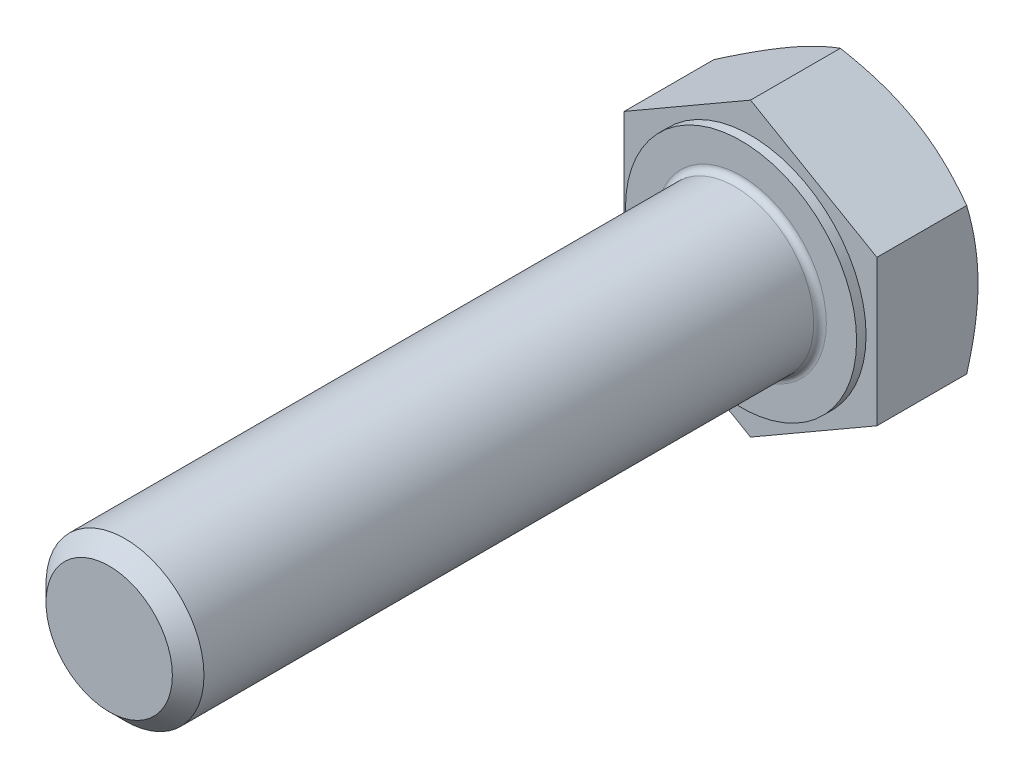
ISO-10303-21;
HEADER;
FILE_DESCRIPTION(('STEP AP214'),'2;1');
FILE_NAME('part.step','',(''),(''),'','','');
FILE_SCHEMA(('AUTOMOTIVE_DESIGN { 1 0 10303 214 1 1 1 1 }'));
ENDSEC;
DATA;
#1=APPLICATION_CONTEXT('core data for automotive mechanical design processes');
#2=APPLICATION_PROTOCOL_DEFINITION('international standard','automotive_design',2000,#1);
#3=PRODUCT_CONTEXT('',#1,'mechanical');
#4=PRODUCT('Part','Part','',(#3));
#5=PRODUCT_RELATED_PRODUCT_CATEGORY('part','',(#4));
#6=PRODUCT_DEFINITION_FORMATION('','',#4);
#7=PRODUCT_DEFINITION_CONTEXT('part definition',#1,'design');
#8=PRODUCT_DEFINITION('design','',#6,#7);
#9=PRODUCT_DEFINITION_SHAPE('','',#8);
#10=(LENGTH_UNIT() NAMED_UNIT(*) SI_UNIT(.MILLI.,.METRE.));
#11=(NAMED_UNIT(*) PLANE_ANGLE_UNIT() SI_UNIT($,.RADIAN.));
#12=(NAMED_UNIT(*) SI_UNIT($,.STERADIAN.) SOLID_ANGLE_UNIT());
#13=UNCERTAINTY_MEASURE_WITH_UNIT(LENGTH_MEASURE(1.E-05),#10,'distance_accuracy_value','');
#14=(GEOMETRIC_REPRESENTATION_CONTEXT(3) GLOBAL_UNCERTAINTY_ASSIGNED_CONTEXT((#13)) GLOBAL_UNIT_ASSIGNED_CONTEXT((#10,
#11,#12)) REPRESENTATION_CONTEXT('',''));
#15=CARTESIAN_POINT('',(0.,0.,0.));
#16=DIRECTION('',(0.,0.,1.));
#17=DIRECTION('',(1.,0.,0.));
#18=AXIS2_PLACEMENT_3D('',#15,#16,#17);
#19=CARTESIAN_POINT('',(0.,0.,7.));
#20=DIRECTION('',(0.,0.,1.));
#21=DIRECTION('',(1.,0.,0.));
#22=AXIS2_PLACEMENT_3D('',#19,#20,#21);
#23=PLANE('',#22);
#24=CARTESIAN_POINT('',(0.,0.,7.));
#25=DIRECTION('',(0.,0.,1.));
#26=DIRECTION('',(1.,0.,0.));
#27=AXIS2_PLACEMENT_3D('',#24,#25,#26);
#28=CIRCLE('',#27,5.4);
#29=CARTESIAN_POINT('',(5.4,0.,7.));
#30=VERTEX_POINT('',#29);
#31=EDGE_CURVE('E11',#30,#30,#28,.F.);
#32=ORIENTED_EDGE('',*,*,#31,.T.);
#33=EDGE_LOOP('',(#32));
#34=FACE_BOUND('',#33,.T.);
#35=CARTESIAN_POINT('',(0.,0.,7.));
#36=DIRECTION('',(0.,0.,1.));
#37=DIRECTION('',(1.,0.,0.));
#38=AXIS2_PLACEMENT_3D('',#35,#36,#37);
#39=CIRCLE('',#38,7.315);
#40=CARTESIAN_POINT('',(7.315,0.,7.));
#41=VERTEX_POINT('',#40);
#42=EDGE_CURVE('E263',#41,#41,#39,.T.);
#43=ORIENTED_EDGE('',*,*,#42,.T.);
#44=EDGE_LOOP('',(#43));
#45=FACE_BOUND('',#44,.T.);
#46=ADVANCED_FACE('F28',(#34,#45),#23,.T.);
#47=CARTESIAN_POINT('',(8.,-4.61880215351701,6.4));
#48=DIRECTION('',(0.,0.,1.));
#49=DIRECTION('',(1.,0.,0.));
#50=AXIS2_PLACEMENT_3D('',#47,#48,#49);
#51=PLANE('',#50);
#52=DIRECTION('',(0.866025403784439,0.5,0.));
#53=VECTOR('',#52,1.);
#54=CARTESIAN_POINT('',(0.,-9.23760430703402,6.4));
#55=LINE('',#54,#53);
#56=CARTESIAN_POINT('',(0.,-9.23760430703402,6.4));
#57=VERTEX_POINT('',#56);
#58=CARTESIAN_POINT('',(8.,-4.61880215351701,6.4));
#59=VERTEX_POINT('',#58);
#60=EDGE_CURVE('E283',#57,#59,#55,.T.);
#61=ORIENTED_EDGE('',*,*,#60,.T.);
#62=DIRECTION('',(0.,1.,0.));
#63=VECTOR('',#62,1.);
#64=CARTESIAN_POINT('',(8.,-4.61880215351701,6.4));
#65=LINE('',#64,#63);
#66=CARTESIAN_POINT('',(8.,4.61880215351701,6.4));
#67=VERTEX_POINT('',#66);
#68=EDGE_CURVE('E288',#59,#67,#65,.T.);
#69=ORIENTED_EDGE('',*,*,#68,.T.);
#70=DIRECTION('',(-0.866025403784438,0.5,0.));
#71=VECTOR('',#70,1.);
#72=CARTESIAN_POINT('',(8.,4.61880215351701,6.4));
#73=LINE('',#72,#71);
#74=CARTESIAN_POINT('',(0.,9.23760430703401,6.4));
#75=VERTEX_POINT('',#74);
#76=EDGE_CURVE('E285',#67,#75,#73,.T.);
#77=ORIENTED_EDGE('',*,*,#76,.T.);
#78=DIRECTION('',(-0.866025403784439,-0.5,0.));
#79=VECTOR('',#78,1.);
#80=CARTESIAN_POINT('',(0.,9.23760430703401,6.4));
#81=LINE('',#80,#79);
#82=CARTESIAN_POINT('',(-8.,4.61880215351701,6.4));
#83=VERTEX_POINT('',#82);
#84=EDGE_CURVE('E284',#75,#83,#81,.T.);
#85=ORIENTED_EDGE('',*,*,#84,.T.);
#86=DIRECTION('',(0.,-1.,0.));
#87=VECTOR('',#86,1.);
#88=CARTESIAN_POINT('',(-8.,4.61880215351701,6.4));
#89=LINE('',#88,#87);
#90=CARTESIAN_POINT('',(-8.,-4.618802153517,6.4));
#91=VERTEX_POINT('',#90);
#92=EDGE_CURVE('E206',#83,#91,#89,.T.);
#93=ORIENTED_EDGE('',*,*,#92,.T.);
#94=DIRECTION('',(0.866025403784438,-0.5,0.));
#95=VECTOR('',#94,1.);
#96=CARTESIAN_POINT('',(-8.,-4.618802153517,6.4));
#97=LINE('',#96,#95);
#98=EDGE_CURVE('E278',#91,#57,#97,.T.);
#99=ORIENTED_EDGE('',*,*,#98,.T.);
#100=EDGE_LOOP('',(#61,#69,#77,#85,#93,#99));
#101=FACE_BOUND('',#100,.T.);
#102=CARTESIAN_POINT('',(0.,0.,6.4));
#103=DIRECTION('',(0.,0.,1.));
#104=DIRECTION('',(1.,0.,0.));
#105=AXIS2_PLACEMENT_3D('',#102,#103,#104);
#106=CIRCLE('',#105,7.315);
#107=CARTESIAN_POINT('',(7.315,0.,6.4));
#108=VERTEX_POINT('',#107);
#109=EDGE_CURVE('E266',#108,#108,#106,.T.);
#110=ORIENTED_EDGE('',*,*,#109,.F.);
#111=EDGE_LOOP('',(#110));
#112=FACE_BOUND('',#111,.T.);
#113=ADVANCED_FACE('F243',(#101,#112),#51,.T.);
#114=CARTESIAN_POINT('',(0.,-9.23760430703402,6.4));
#115=DIRECTION('',(-0.5,0.866025403784439,0.));
#116=DIRECTION('',(-0.866025403784439,-0.5,0.));
#117=AXIS2_PLACEMENT_3D('',#114,#115,#116);
#118=PLANE('',#117);
#119=CARTESIAN_POINT('',(8.0002,-4.61868668346317,0.714597847732972));
#120=CARTESIAN_POINT('',(7.8243512161201,-4.7202130261729,0.655990714047297));
#121=CARTESIAN_POINT('',(7.64784680569387,-4.82211789504564,0.60004340104729));
#122=CARTESIAN_POINT('',(7.29340453712154,-5.02675523421806,0.494201005024666));
#123=CARTESIAN_POINT('',(7.11546609530729,-5.1294880414987,0.444308534431067));
#124=CARTESIAN_POINT('',(6.57880176237736,-5.43933133858027,0.304692797206867));
#125=CARTESIAN_POINT('',(6.21795741776428,-5.64766491807818,0.22528117097837));
#126=CARTESIAN_POINT('',(5.67796082979595,-5.95943209350318,0.132161646294492));
#127=CARTESIAN_POINT('',(5.50042181035671,-6.06193429416808,0.105634581029128));
#128=CARTESIAN_POINT('',(5.1445408870398,-6.26740224104455,0.0611531748588798));
#129=CARTESIAN_POINT('',(4.96619905550676,-6.37036794548793,0.0431980765145843));
#130=CARTESIAN_POINT('',(4.6092083151764,-6.57647664551586,0.0163156484918698));
#131=CARTESIAN_POINT('',(4.4305599863905,-6.67961930623068,0.00737807354623821));
#132=CARTESIAN_POINT('',(4.07309829490261,-6.88599991003619,-0.00127769603486519));
#133=CARTESIAN_POINT('',(3.89428493746993,-6.98923785008465,-0.000996175497145661));
#134=CARTESIAN_POINT('',(3.55998663298309,-7.18224506616976,0.00814502526878037));
#135=CARTESIAN_POINT('',(3.40447809566132,-7.27202796205377,0.015889604367375));
#136=CARTESIAN_POINT('',(3.09382523825949,-7.45138347289924,0.0382011348534339));
#137=CARTESIAN_POINT('',(2.93868094344,-7.54095607327651,0.0527685461381527));
#138=CARTESIAN_POINT('',(2.47384868410518,-7.80932710333149,0.106360690527541));
#139=CARTESIAN_POINT('',(2.16498351281828,-7.98765049311728,0.155268641669149));
#140=CARTESIAN_POINT('',(1.5439767712397,-8.34618890253624,0.277539403234317));
#141=CARTESIAN_POINT('',(1.23191445788552,-8.52635816315522,0.351420520376003));
#142=CARTESIAN_POINT('',(0.612443518305242,-8.88400987687704,0.519100141254974));
#143=CARTESIAN_POINT('',(0.30502695910825,-9.06149691008277,0.612859260854457));
#144=CARTESIAN_POINT('',(-0.000199999999999189,-9.23771977708785,0.714597847732977));
#145=B_SPLINE_CURVE_WITH_KNOTS('',3,(#119,#120,#121,#122,#123,#124,#125,#126,#127,#128,#129,
#130,#131,#132,#133,#134,#135,#136,#137,#138,#139,#140,#141,#142,#143,#144),.UNSPECIFIED.,.F.,
.F.,(4,2,2,2,2,2,2,2,2,2,2,2,4),(0.,0.63397354372135,1.26821965714356,2.53934712434766,
3.15934343977049,3.77928496069784,4.39852133866766,5.01773858515595,5.55680239410249,
6.09590254421148,7.17487077411835,8.27776850154292,9.37850115249054),.UNSPECIFIED.);
#146=CARTESIAN_POINT('',(8.,-4.61880215351701,0.71453117981632));
#147=VERTEX_POINT('',#146);
#148=CARTESIAN_POINT('',(4.00000000000001,-6.92820323027551,0.));
#149=VERTEX_POINT('',#148);
#150=EDGE_CURVE('E121',#147,#149,#145,.T.);
#151=ORIENTED_EDGE('',*,*,#150,.F.);
#152=DIRECTION('',(0.,0.,-1.));
#153=VECTOR('',#152,1.);
#154=CARTESIAN_POINT('',(8.,-4.61880215351701,6.4));
#155=LINE('',#154,#153);
#156=EDGE_CURVE('E125',#59,#147,#155,.T.);
#157=ORIENTED_EDGE('',*,*,#156,.F.);
#158=ORIENTED_EDGE('',*,*,#60,.F.);
#159=DIRECTION('',(0.,0.,-1.));
#160=VECTOR('',#159,1.);
#161=CARTESIAN_POINT('',(0.,-9.23760430703402,6.4));
#162=LINE('',#161,#160);
#163=CARTESIAN_POINT('',(0.,-9.23760430703402,0.714531179816326));
#164=VERTEX_POINT('',#163);
#165=EDGE_CURVE('E213',#57,#164,#162,.T.);
#166=ORIENTED_EDGE('',*,*,#165,.T.);
#167=EDGE_CURVE('E180',#149,#164,#145,.T.);
#168=ORIENTED_EDGE('',*,*,#167,.F.);
#169=EDGE_LOOP('',(#151,#157,#158,#166,#168));
#170=FACE_BOUND('',#169,.T.);
#171=ADVANCED_FACE('F30',(#170),#118,.F.);
#172=CARTESIAN_POINT('',(8.,-4.61880215351701,6.4));
#173=DIRECTION('',(-1.,0.,0.));
#174=DIRECTION('',(0.,0.,1.));
#175=AXIS2_PLACEMENT_3D('',#172,#173,#174);
#176=PLANE('',#175);
#177=CARTESIAN_POINT('',(8.,-12.5978512302027,3.99718793503962));
#178=CARTESIAN_POINT('',(8.,-12.246746193335,3.82611053576499));
#179=CARTESIAN_POINT('',(8.,-11.8948553361064,3.65661925769115));
#180=CARTESIAN_POINT('',(8.,-11.1890846886661,3.3216974888996));
#181=CARTESIAN_POINT('',(8.,-10.835204611765,3.15626760296746));
#182=CARTESIAN_POINT('',(8.,-10.1233054863219,2.82956556361424));
#183=CARTESIAN_POINT('',(8.,-9.76527449682906,2.6683193432713));
#184=CARTESIAN_POINT('',(8.,-9.04643054583631,2.35217634713934));
#185=CARTESIAN_POINT('',(8.,-8.68561771136527,2.19727928344183));
#186=CARTESIAN_POINT('',(8.,-7.94836823401664,1.89039831156782));
#187=CARTESIAN_POINT('',(8.,-7.5718160886765,1.7386904007907));
#188=CARTESIAN_POINT('',(8.,-6.81437869582219,1.44630030243335));
#189=CARTESIAN_POINT('',(8.,-6.43349297805851,1.30561932474278));
#190=CARTESIAN_POINT('',(8.,-5.6674305979848,1.03883650463493));
#191=CARTESIAN_POINT('',(8.,-5.28226375872601,0.912706749891732));
#192=CARTESIAN_POINT('',(8.,-4.50642197899132,0.678945126437137));
#193=CARTESIAN_POINT('',(8.,-4.11574875302432,0.571307631748258));
#194=CARTESIAN_POINT('',(8.,-3.33076858815041,0.380144492729918));
#195=CARTESIAN_POINT('',(8.,-2.93649538955179,0.296483961640422));
#196=CARTESIAN_POINT('',(8.,-2.34134760728195,0.192507403054087));
#197=CARTESIAN_POINT('',(8.,-2.1423290800816,0.161432948424243));
#198=CARTESIAN_POINT('',(8.,-1.74323916388529,0.107059745466563));
#199=CARTESIAN_POINT('',(8.,-1.54316787913643,0.083760241429815));
#200=CARTESIAN_POINT('',(8.,-1.14493807260308,0.0457037663801395));
#201=CARTESIAN_POINT('',(8.,-0.946790216902655,0.0308356599409834));
#202=CARTESIAN_POINT('',(8.,-0.550042658772993,0.0094999742244421));
#203=CARTESIAN_POINT('',(8.,-0.351442964202048,0.00303224995131287));
#204=CARTESIAN_POINT('',(8.,0.0458536813573945,-0.0013475365439198));
#205=CARTESIAN_POINT('',(8.,0.244550632880897,0.00074044883954244));
#206=CARTESIAN_POINT('',(8.,0.641675332001747,0.0134189761363866));
#207=CARTESIAN_POINT('',(8.,0.840103066876642,0.0240099067559181));
#208=CARTESIAN_POINT('',(8.,1.31123186508473,0.0590218926365067));
#209=CARTESIAN_POINT('',(8.,1.58366327386944,0.0871569085158355));
#210=CARTESIAN_POINT('',(8.,2.12661564573487,0.157962894403156));
#211=CARTESIAN_POINT('',(8.,2.3971363661909,0.200635677751085));
#212=CARTESIAN_POINT('',(8.,3.20545284137283,0.348206948211211));
#213=CARTESIAN_POINT('',(8.,3.73973646457263,0.472635835403912));
#214=CARTESIAN_POINT('',(8.,4.53906436560801,0.689870047712877));
#215=CARTESIAN_POINT('',(8.,4.80821183359779,0.768458170261179));
#216=CARTESIAN_POINT('',(8.,5.34389592451214,0.934158299445939));
#217=CARTESIAN_POINT('',(8.,5.61043252727901,1.02127037183623));
#218=CARTESIAN_POINT('',(8.,6.14097486865218,1.20259084399542));
#219=CARTESIAN_POINT('',(8.,6.40498129578473,1.29679724762058));
#220=CARTESIAN_POINT('',(8.,6.93077992716977,1.49116187479546));
#221=CARTESIAN_POINT('',(8.,7.19257218213156,1.59131996161493));
#222=CARTESIAN_POINT('',(8.,7.89757234436719,1.86876864611977));
#223=CARTESIAN_POINT('',(8.,8.33892089987206,2.05077943488026));
#224=CARTESIAN_POINT('',(8.,9.21706508189077,2.42550998940699));
#225=CARTESIAN_POINT('',(8.,9.65386019466902,2.61823094833073));
#226=CARTESIAN_POINT('',(8.,10.5239434374363,3.01184512227045));
#227=CARTESIAN_POINT('',(8.,10.9572301479345,3.21274146455429));
#228=CARTESIAN_POINT('',(8.,11.8208356781987,3.62074922091354));
#229=CARTESIAN_POINT('',(8.,12.2511546186012,3.82786038051032));
#230=CARTESIAN_POINT('',(8.,13.1101061451692,4.24728155627692));
#231=CARTESIAN_POINT('',(8.,13.538734891615,4.45959941940585));
#232=CARTESIAN_POINT('',(8.,14.3940561255566,4.88810242303667));
#233=CARTESIAN_POINT('',(8.,14.8207485968082,5.10428759590831));
#234=CARTESIAN_POINT('',(8.,15.6724483801741,5.53971653184117));
#235=CARTESIAN_POINT('',(8.,16.0974560462025,5.75895960347351));
#236=CARTESIAN_POINT('',(8.,16.946155785995,6.1999789123004));
#237=CARTESIAN_POINT('',(8.,17.3698478544564,6.42175515968834));
#238=CARTESIAN_POINT('',(8.,18.5495919939929,7.04296873456249));
#239=CARTESIAN_POINT('',(8.,19.3044430685455,7.44468640301345));
#240=CARTESIAN_POINT('',(8.,20.8116128705593,8.25294502935688));
#241=CARTESIAN_POINT('',(8.,21.563931437839,8.65948628524741));
#242=CARTESIAN_POINT('',(8.,23.0640825537621,9.47479055108793));
#243=CARTESIAN_POINT('',(8.,23.8119216778553,9.88354147007992));
#244=CARTESIAN_POINT('',(8.,24.9325210040827,10.4987075967037));
#245=CARTESIAN_POINT('',(8.,25.305846272756,10.7040948381256));
#246=CARTESIAN_POINT('',(8.,26.0521604299717,11.1154785141045));
#247=CARTESIAN_POINT('',(8.,26.4251493189334,11.321474947901));
#248=CARTESIAN_POINT('',(8.,26.7979906098644,11.527738247101));
#249=B_SPLINE_CURVE_WITH_KNOTS('',3,(#177,#178,#179,#180,#181,#182,#183,#184,#185,#186,#187,
#188,#189,#190,#191,#192,#193,#194,#195,#196,#197,#198,#199,#200,#201,#202,#203,#204,#205,#206,
#207,#208,#209,#210,#211,#212,#213,#214,#215,#216,#217,#218,#219,#220,#221,#222,#223,#224,#225,
#226,#227,#228,#229,#230,#231,#232,#233,#234,#235,#236,#237,#238,#239,#240,#241,#242,#243,#244,
#245,#246,#247,#248),.UNSPECIFIED.,.F.,.F.,(4,2,2,2,2,2,2,2,2,2,2,2,2,2,2,2,2,2,2,2,2,2,2,2,2,2,
2,2,2,2,2,2,2,2,2,4),(0.,1.17171303757608,2.34359951048675,3.52154779988272,4.69944261487828,
5.9172006018258,7.13509201629464,8.350606984233,9.56575149358517,10.7739194195453,
11.3780811947188,11.982184229517,12.5781274788067,13.174060441614,13.7699967203081,
14.3659602433606,15.1871414998263,16.0084252222517,17.651791220792,18.4928743658415,
19.3339639995266,20.1748178523692,21.0156523954214,22.4476587813298,23.87982501976,
25.3125443406161,26.7452050756368,28.1801767110294,29.6151603628915,31.0498246444422,
32.48449470105,35.0497345139727,37.6151336395593,40.1718943005759,41.4501744055995,
42.7284529156064),.UNSPECIFIED.);
#250=CARTESIAN_POINT('',(8.,4.61880215351701,0.714531179816318));
#251=VERTEX_POINT('',#250);
#252=CARTESIAN_POINT('',(8.,0.,0.));
#253=VERTEX_POINT('',#252);
#254=EDGE_CURVE('E100',#251,#253,#249,.F.);
#255=ORIENTED_EDGE('',*,*,#254,.F.);
#256=DIRECTION('',(0.,0.,-1.));
#257=VECTOR('',#256,1.);
#258=CARTESIAN_POINT('',(8.,4.61880215351701,6.4));
#259=LINE('',#258,#257);
#260=EDGE_CURVE('E210',#67,#251,#259,.T.);
#261=ORIENTED_EDGE('',*,*,#260,.F.);
#262=ORIENTED_EDGE('',*,*,#68,.F.);
#263=ORIENTED_EDGE('',*,*,#156,.T.);
#264=EDGE_CURVE('E113',#253,#147,#249,.F.);
#265=ORIENTED_EDGE('',*,*,#264,.F.);
#266=EDGE_LOOP('',(#255,#261,#262,#263,#265));
#267=FACE_BOUND('',#266,.T.);
#268=ADVANCED_FACE('F132',(#267),#176,.F.);
#269=CARTESIAN_POINT('',(8.,4.61880215351701,6.4));
#270=DIRECTION('',(-0.5,-0.866025403784438,0.));
#271=DIRECTION('',(0.866025403784439,-0.5,0.));
#272=AXIS2_PLACEMENT_3D('',#269,#270,#271);
#273=PLANE('',#272);
#274=CARTESIAN_POINT('',(-0.000199999999997921,9.23771977708785,0.714597847732978));
#275=CARTESIAN_POINT('',(0.175648783879899,9.13619343437813,0.655990714047302));
#276=CARTESIAN_POINT('',(0.352153194306137,9.03428856550538,0.600043401047294));
#277=CARTESIAN_POINT('',(0.706595462878462,8.82965122633297,0.49420100502467));
#278=CARTESIAN_POINT('',(0.884533904692714,8.72691841905232,0.444308534431071));
#279=CARTESIAN_POINT('',(1.42119823762264,8.41707512197076,0.304692797206871));
#280=CARTESIAN_POINT('',(1.78204258223573,8.20874154247284,0.225281170978373));
#281=CARTESIAN_POINT('',(2.32203917020405,7.89697436704785,0.132161646294493));
#282=CARTESIAN_POINT('',(2.49957818964329,7.79447216638294,0.105634581029128));
#283=CARTESIAN_POINT('',(2.8554591129602,7.58900421950647,0.0611531748588797));
#284=CARTESIAN_POINT('',(3.03380094449324,7.4860385150631,0.0431980765145844));
#285=CARTESIAN_POINT('',(3.3907916848236,7.27992981503517,0.0163156484918698));
#286=CARTESIAN_POINT('',(3.5694400136095,7.17678715432034,0.00737807354623788));
#287=CARTESIAN_POINT('',(3.92690170509738,6.97040655051484,-0.00127769603486618));
#288=CARTESIAN_POINT('',(4.10571506253007,6.86716861046638,-0.000996175497146947));
#289=CARTESIAN_POINT('',(4.44001336701691,6.67416139438127,0.00814502526877859));
#290=CARTESIAN_POINT('',(4.59552190433867,6.58437849849726,0.015889604367373));
#291=CARTESIAN_POINT('',(4.90617476174051,6.40502298765178,0.0382011348534309));
#292=CARTESIAN_POINT('',(5.06131905656,6.31545038727452,0.0527685461381492));
#293=CARTESIAN_POINT('',(5.52615131589482,6.04707935721954,0.106360690527536));
#294=CARTESIAN_POINT('',(5.83501648718172,5.86875596743374,0.155268641669144));
#295=CARTESIAN_POINT('',(6.4560232287603,5.51021755801478,0.277539403234312));
#296=CARTESIAN_POINT('',(6.76808554211448,5.33004829739581,0.351420520375996));
#297=CARTESIAN_POINT('',(7.38755648169476,4.97239658367398,0.519100141254967));
#298=CARTESIAN_POINT('',(7.69497304089175,4.79490955046825,0.61285926085445));
#299=CARTESIAN_POINT('',(8.0002,4.61868668346317,0.71459784773297));
#300=B_SPLINE_CURVE_WITH_KNOTS('',3,(#274,#275,#276,#277,#278,#279,#280,#281,#282,#283,#284,
#285,#286,#287,#288,#289,#290,#291,#292,#293,#294,#295,#296,#297,#298,#299),.UNSPECIFIED.,.F.,
.F.,(4,2,2,2,2,2,2,2,2,2,2,2,4),(0.,0.63397354372135,1.26821965714356,2.53934712434766,
3.15934343977049,3.77928496069784,4.39852133866766,5.01773858515595,5.55680239410248,
6.09590254421147,7.17487077411834,8.27776850154292,9.37850115249054),.UNSPECIFIED.);
#301=CARTESIAN_POINT('',(0.,9.23760430703401,0.714531179816326));
#302=VERTEX_POINT('',#301);
#303=CARTESIAN_POINT('',(4.00000000000001,6.92820323027551,0.));
#304=VERTEX_POINT('',#303);
#305=EDGE_CURVE('E44',#302,#304,#300,.T.);
#306=ORIENTED_EDGE('',*,*,#305,.F.);
#307=DIRECTION('',(0.,0.,-1.));
#308=VECTOR('',#307,1.);
#309=CARTESIAN_POINT('',(0.,9.23760430703401,6.4));
#310=LINE('',#309,#308);
#311=EDGE_CURVE('E207',#75,#302,#310,.T.);
#312=ORIENTED_EDGE('',*,*,#311,.F.);
#313=ORIENTED_EDGE('',*,*,#76,.F.);
#314=ORIENTED_EDGE('',*,*,#260,.T.);
#315=EDGE_CURVE('E107',#304,#251,#300,.T.);
#316=ORIENTED_EDGE('',*,*,#315,.F.);
#317=EDGE_LOOP('',(#306,#312,#313,#314,#316));
#318=FACE_BOUND('',#317,.T.);
#319=ADVANCED_FACE('F157',(#318),#273,.F.);
#320=CARTESIAN_POINT('',(0.,9.23760430703401,6.4));
#321=DIRECTION('',(0.5,-0.866025403784439,0.));
#322=DIRECTION('',(0.866025403784439,0.5,0.));
#323=AXIS2_PLACEMENT_3D('',#320,#321,#322);
#324=PLANE('',#323);
#325=CARTESIAN_POINT('',(-8.0002,4.61868668346317,0.714597847732985));
#326=CARTESIAN_POINT('',(-7.8243512161201,4.7202130261729,0.65599071404731));
#327=CARTESIAN_POINT('',(-7.64784680569387,4.82211789504564,0.600043401047302));
#328=CARTESIAN_POINT('',(-7.29340453712154,5.02675523421806,0.494201005024678));
#329=CARTESIAN_POINT('',(-7.11546609530729,5.1294880414987,0.444308534431078));
#330=CARTESIAN_POINT('',(-6.57880176237736,5.43933133858026,0.304692797206877));
#331=CARTESIAN_POINT('',(-6.21795741776428,5.64766491807818,0.22528117097838));
#332=CARTESIAN_POINT('',(-5.67796082979595,5.95943209350317,0.1321616462945));
#333=CARTESIAN_POINT('',(-5.50042181035672,6.06193429416807,0.105634581029135));
#334=CARTESIAN_POINT('',(-5.1445408870398,6.26740224104455,0.0611531748588863));
#335=CARTESIAN_POINT('',(-4.96619905550676,6.37036794548792,0.043198076514591));
#336=CARTESIAN_POINT('',(-4.60920831517641,6.57647664551585,0.016315648491876));
#337=CARTESIAN_POINT('',(-4.4305599863905,6.67961930623068,0.00737807354624375));
#338=CARTESIAN_POINT('',(-4.07309829490262,6.88599991003618,-0.00127769603486025));
#339=CARTESIAN_POINT('',(-3.89428493746994,6.98923785008464,-0.000996175497140606));
#340=CARTESIAN_POINT('',(-3.5599866329831,7.18224506616975,0.00814502526878459));
#341=CARTESIAN_POINT('',(-3.40447809566133,7.27202796205376,0.0158896043673784));
#342=CARTESIAN_POINT('',(-3.09382523825949,7.45138347289924,0.0382011348534363));
#343=CARTESIAN_POINT('',(-2.93868094344,7.5409560732765,0.0527685461381552));
#344=CARTESIAN_POINT('',(-2.47384868410519,7.80932710333148,0.106360690527543));
#345=CARTESIAN_POINT('',(-2.16498351281828,7.98765049311728,0.15526864166915));
#346=CARTESIAN_POINT('',(-1.5439767712397,8.34618890253624,0.277539403234318));
#347=CARTESIAN_POINT('',(-1.23191445788552,8.52635816315521,0.351420520376002));
#348=CARTESIAN_POINT('',(-0.612443518305241,8.88400987687704,0.519100141254973));
#349=CARTESIAN_POINT('',(-0.305026959108248,9.06149691008277,0.612859260854456));
#350=CARTESIAN_POINT('',(0.000200000000001219,9.23771977708785,0.714597847732976));
#351=B_SPLINE_CURVE_WITH_KNOTS('',3,(#325,#326,#327,#328,#329,#330,#331,#332,#333,#334,#335,
#336,#337,#338,#339,#340,#341,#342,#343,#344,#345,#346,#347,#348,#349,#350),.UNSPECIFIED.,.F.,
.F.,(4,2,2,2,2,2,2,2,2,2,2,2,4),(0.,0.63397354372135,1.26821965714356,2.53934712434765,
3.15934343977049,3.77928496069783,4.39852133866765,5.01773858515595,5.55680239410248,
6.09590254421147,7.17487077411834,8.27776850154292,9.37850115249054),.UNSPECIFIED.);
#352=CARTESIAN_POINT('',(-8.,4.61880215351701,0.714531179816333));
#353=VERTEX_POINT('',#352);
#354=CARTESIAN_POINT('',(-3.99999999999999,6.92820323027552,0.));
#355=VERTEX_POINT('',#354);
#356=EDGE_CURVE('E52',#353,#355,#351,.T.);
#357=ORIENTED_EDGE('',*,*,#356,.F.);
#358=DIRECTION('',(0.,0.,-1.));
#359=VECTOR('',#358,1.);
#360=CARTESIAN_POINT('',(-8.,4.61880215351701,6.4));
#361=LINE('',#360,#359);
#362=EDGE_CURVE('E202',#83,#353,#361,.T.);
#363=ORIENTED_EDGE('',*,*,#362,.F.);
#364=ORIENTED_EDGE('',*,*,#84,.F.);
#365=ORIENTED_EDGE('',*,*,#311,.T.);
#366=EDGE_CURVE('E112',#355,#302,#351,.T.);
#367=ORIENTED_EDGE('',*,*,#366,.F.);
#368=EDGE_LOOP('',(#357,#363,#364,#365,#367));
#369=FACE_BOUND('',#368,.T.);
#370=ADVANCED_FACE('F160',(#369),#324,.F.);
#371=CARTESIAN_POINT('',(-8.,4.61880215351701,6.4));
#372=DIRECTION('',(1.,0.,0.));
#373=DIRECTION('',(0.,1.,0.));
#374=AXIS2_PLACEMENT_3D('',#371,#372,#373);
#375=PLANE('',#374);
#376=CARTESIAN_POINT('',(-8.,-12.5978512379924,3.99718793883617));
#377=CARTESIAN_POINT('',(-8.,-12.2467462008623,3.82611053940336));
#378=CARTESIAN_POINT('',(-8.,-11.8948553433713,3.65661926117142));
#379=CARTESIAN_POINT('',(-8.,-11.1890846954052,3.32169749206444));
#380=CARTESIAN_POINT('',(-8.,-10.8352046182408,3.15626760597497));
#381=CARTESIAN_POINT('',(-8.,-10.1233054922673,2.829565566307));
#382=CARTESIAN_POINT('',(-8.,-9.7652745025072,2.66831934580667));
#383=CARTESIAN_POINT('',(-8.,-9.04643055097819,2.35217634936254));
#384=CARTESIAN_POINT('',(-8.,-8.68561771623813,2.19727928551024));
#385=CARTESIAN_POINT('',(-8.,-7.9483682383301,1.89039831332188));
#386=CARTESIAN_POINT('',(-8.,-7.5718160926994,1.73869040238557));
#387=CARTESIAN_POINT('',(-8.,-6.81437869925937,1.44630030371826));
#388=CARTESIAN_POINT('',(-8.,-6.4334929812005,1.30561932587693));
#389=CARTESIAN_POINT('',(-8.,-5.66743060053097,1.03883650548181));
#390=CARTESIAN_POINT('',(-8.,-5.28226376097155,0.91270675060207));
#391=CARTESIAN_POINT('',(-8.,-4.50642198062752,0.678945126896416));
#392=CARTESIAN_POINT('',(-8.,-4.11574875435181,0.571307632093006));
#393=CARTESIAN_POINT('',(-8.,-3.33076858870341,0.38014449284332));
#394=CARTESIAN_POINT('',(-8.,-2.93649538963686,0.296483961645677));
#395=CARTESIAN_POINT('',(-8.,-2.34134760665674,0.192507402949686));
#396=CARTESIAN_POINT('',(-8.,-2.14232907921831,0.161432948292062));
#397=CARTESIAN_POINT('',(-8.,-1.74323916254378,0.107059745298372));
#398=CARTESIAN_POINT('',(-8.,-1.54316787755479,0.0837602412533909));
#399=CARTESIAN_POINT('',(-8.,-1.14493807054613,0.0457037662085285));
#400=CARTESIAN_POINT('',(-8.,-0.946790214610575,0.0308356597820254));
#401=CARTESIAN_POINT('',(-8.,-0.550042656011034,0.00949997411163333));
#402=CARTESIAN_POINT('',(-8.,-0.351442961205343,0.00303224987200008));
#403=CARTESIAN_POINT('',(-8.,0.0458536848218874,-0.00134753653581453));
#404=CARTESIAN_POINT('',(-8.,0.244550636578433,0.000740448901573155));
#405=CARTESIAN_POINT('',(-8.,0.64167533616237,0.0134189763252926));
#406=CARTESIAN_POINT('',(-8.,0.840103071267309,0.0240099070177759));
#407=CARTESIAN_POINT('',(-8.,1.31123186982789,0.0590218930776946));
#408=CARTESIAN_POINT('',(-8.,1.58366327873405,0.0871569090600347));
#409=CARTESIAN_POINT('',(-8.,2.12661565083681,0.157962895158845));
#410=CARTESIAN_POINT('',(-8.,2.39713637140872,0.200635678615254));
#411=CARTESIAN_POINT('',(-8.,3.20545284693186,0.348206949403033));
#412=CARTESIAN_POINT('',(-8.,3.73973647035001,0.472635836816984));
#413=CARTESIAN_POINT('',(-8.,4.53906437171197,0.689870049452267));
#414=CARTESIAN_POINT('',(-8.,4.80821183981299,0.768458172110086));
#415=CARTESIAN_POINT('',(-8.,5.34389593094853,0.934158301510459));
#416=CARTESIAN_POINT('',(-8.,5.61043253382536,1.02127037400685));
#417=CARTESIAN_POINT('',(-8.,6.1409748754176,1.20259084637434));
#418=CARTESIAN_POINT('',(-8.,6.40498130265926,1.29679725010171));
#419=CARTESIAN_POINT('',(-8.,6.93077993426255,1.49116187747738));
#420=CARTESIAN_POINT('',(-8.,7.19257218933346,1.59131996439543));
#421=CARTESIAN_POINT('',(-8.,7.89757235163044,1.86876864907013));
#422=CARTESIAN_POINT('',(-8.,8.33892090709077,2.05077943789115));
#423=CARTESIAN_POINT('',(-8.,9.21706508902617,2.42550999252133));
#424=CARTESIAN_POINT('',(-8.,9.65386020176566,2.618230951488));
#425=CARTESIAN_POINT('',(-8.,10.5239434444595,3.01184512550084));
#426=CARTESIAN_POINT('',(-8.,10.9572301549231,3.21274146781486));
#427=CARTESIAN_POINT('',(-8.,11.8208356851217,3.62074922422548));
#428=CARTESIAN_POINT('',(-8.,12.2511546254934,3.82786038384345));
#429=CARTESIAN_POINT('',(-8.,13.1101061520005,4.24728155964496));
#430=CARTESIAN_POINT('',(-8.,13.5387348984163,4.45959942278756));
#431=CARTESIAN_POINT('',(-8.,14.3940561323002,4.8881024264408));
#432=CARTESIAN_POINT('',(-8.,14.8207486035241,5.10428759932118));
#433=CARTESIAN_POINT('',(-8.,15.6724483868366,5.53971653526798));
#434=CARTESIAN_POINT('',(-8.,16.0974560528393,5.75895960690551));
#435=CARTESIAN_POINT('',(-8.,16.9461557925818,6.19997891573996));
#436=CARTESIAN_POINT('',(-8.,17.3698478610189,6.42175516313026));
#437=CARTESIAN_POINT('',(-8.,18.54959200053,7.04296873802942));
#438=CARTESIAN_POINT('',(-8.,19.3044430750825,7.44468640650099));
#439=CARTESIAN_POINT('',(-8.,20.8116128770979,8.25294503288145));
#440=CARTESIAN_POINT('',(-8.,21.5639314443794,8.6594862887884));
#441=CARTESIAN_POINT('',(-8.,23.0640825603146,9.47479055466269));
#442=CARTESIAN_POINT('',(-8.,23.811921684418,9.88354147367208));
#443=CARTESIAN_POINT('',(-8.,24.9325210106616,10.4987076003205));
#444=CARTESIAN_POINT('',(-8.,25.3058462793405,10.7040948417505));
#445=CARTESIAN_POINT('',(-8.,26.0521604365676,11.115478517745));
#446=CARTESIAN_POINT('',(-8.,26.4251493255351,11.321474951549));
#447=CARTESIAN_POINT('',(-8.,26.797990616472,11.5277382507565));
#448=B_SPLINE_CURVE_WITH_KNOTS('',3,(#376,#377,#378,#379,#380,#381,#382,#383,#384,#385,#386,
#387,#388,#389,#390,#391,#392,#393,#394,#395,#396,#397,#398,#399,#400,#401,#402,#403,#404,#405,
#406,#407,#408,#409,#410,#411,#412,#413,#414,#415,#416,#417,#418,#419,#420,#421,#422,#423,#424,
#425,#426,#427,#428,#429,#430,#431,#432,#433,#434,#435,#436,#437,#438,#439,#440,#441,#442,#443,
#444,#445,#446,#447),.UNSPECIFIED.,.F.,.F.,(4,2,2,2,2,2,2,2,2,2,2,2,2,2,2,2,2,2,2,2,2,2,2,2,2,2,
2,2,2,2,2,2,2,2,2,4),(0.,1.17171303849132,2.34359951231736,3.52154780263822,4.69944261855859,
5.917200606493,7.13509202194904,8.35060699087143,9.56575150120687,10.773919428604,
11.3780812044956,11.9821842400116,12.5781274900013,13.1740604535085,13.7699967329028,
14.3659602566554,15.1871415135151,16.0084252363345,17.6517912356646,18.4928743811267,
19.3339640152243,20.1748178684784,21.0156524119421,22.447658797797,23.879825036173,
25.3125443569731,26.745205091938,28.1801767272683,29.615160379068,31.0498246605575,
32.484494717104,35.0497345300555,37.6151336556702,40.1718943167388,41.4501744217887,
42.7284529318218),.UNSPECIFIED.);
#449=CARTESIAN_POINT('',(-8.,-4.618802153517,0.714531179816333));
#450=VERTEX_POINT('',#449);
#451=CARTESIAN_POINT('',(-8.00000000000001,0.,0.));
#452=VERTEX_POINT('',#451);
#453=EDGE_CURVE('E175',#450,#452,#448,.T.);
#454=ORIENTED_EDGE('',*,*,#453,.F.);
#455=DIRECTION('',(0.,0.,-1.));
#456=VECTOR('',#455,1.);
#457=CARTESIAN_POINT('',(-8.,-4.618802153517,6.4));
#458=LINE('',#457,#456);
#459=EDGE_CURVE('E208',#91,#450,#458,.T.);
#460=ORIENTED_EDGE('',*,*,#459,.F.);
#461=ORIENTED_EDGE('',*,*,#92,.F.);
#462=ORIENTED_EDGE('',*,*,#362,.T.);
#463=EDGE_CURVE('E134',#452,#353,#448,.T.);
#464=ORIENTED_EDGE('',*,*,#463,.F.);
#465=EDGE_LOOP('',(#454,#460,#461,#462,#464));
#466=FACE_BOUND('',#465,.T.);
#467=ADVANCED_FACE('F165',(#466),#375,.F.);
#468=CARTESIAN_POINT('',(-8.,-4.618802153517,6.4));
#469=DIRECTION('',(0.5,0.866025403784438,0.));
#470=DIRECTION('',(-0.866025403784439,0.5,0.));
#471=AXIS2_PLACEMENT_3D('',#468,#469,#470);
#472=PLANE('',#471);
#473=CARTESIAN_POINT('',(0.00020000000000098,-9.23771977708785,0.714597847732978));
#474=CARTESIAN_POINT('',(-0.175648783879895,-9.13619343437813,0.655990714047304));
#475=CARTESIAN_POINT('',(-0.352153194306134,-9.03428856550538,0.600043401047296));
#476=CARTESIAN_POINT('',(-0.706595462878458,-8.82965122633297,0.494201005024673));
#477=CARTESIAN_POINT('',(-0.884533904692711,-8.72691841905233,0.444308534431073));
#478=CARTESIAN_POINT('',(-1.42119823762264,-8.41707512197076,0.304692797206873));
#479=CARTESIAN_POINT('',(-1.78204258223572,-8.20874154247284,0.225281170978376));
#480=CARTESIAN_POINT('',(-2.32203917020405,-7.89697436704785,0.132161646294497));
#481=CARTESIAN_POINT('',(-2.49957818964328,-7.79447216638295,0.105634581029132));
#482=CARTESIAN_POINT('',(-2.8554591129602,-7.58900421950647,0.0611531748588843));
#483=CARTESIAN_POINT('',(-3.03380094449324,-7.4860385150631,0.0431980765145886));
#484=CARTESIAN_POINT('',(-3.39079168482359,-7.27992981503517,0.0163156484918738));
#485=CARTESIAN_POINT('',(-3.5694400136095,-7.17678715432035,0.007378073546242));
#486=CARTESIAN_POINT('',(-3.92690170509738,-6.97040655051484,-0.0012776960348612));
#487=CARTESIAN_POINT('',(-4.10571506253006,-6.86716861046638,-0.000996175497141255));
#488=CARTESIAN_POINT('',(-4.4400133670169,-6.67416139438127,0.00814502526878476));
#489=CARTESIAN_POINT('',(-4.59552190433867,-6.58437849849726,0.015889604367379));
#490=CARTESIAN_POINT('',(-4.90617476174051,-6.40502298765178,0.0382011348534372));
#491=CARTESIAN_POINT('',(-5.06131905656,-6.31545038727451,0.0527685461381558));
#492=CARTESIAN_POINT('',(-5.52615131589482,-6.04707935721954,0.106360690527543));
#493=CARTESIAN_POINT('',(-5.83501648718172,-5.86875596743374,0.155268641669152));
#494=CARTESIAN_POINT('',(-6.4560232287603,-5.51021755801478,0.277539403234322));
#495=CARTESIAN_POINT('',(-6.76808554211448,-5.3300482973958,0.351420520376007));
#496=CARTESIAN_POINT('',(-7.38755648169476,-4.97239658367398,0.519100141254979));
#497=CARTESIAN_POINT('',(-7.69497304089175,-4.79490955046824,0.612859260854463));
#498=CARTESIAN_POINT('',(-8.0002,-4.61868668346317,0.714597847732983));
#499=B_SPLINE_CURVE_WITH_KNOTS('',3,(#473,#474,#475,#476,#477,#478,#479,#480,#481,#482,#483,
#484,#485,#486,#487,#488,#489,#490,#491,#492,#493,#494,#495,#496,#497,#498),.UNSPECIFIED.,.F.,
.F.,(4,2,2,2,2,2,2,2,2,2,2,2,4),(0.,0.633973543721351,1.26821965714356,2.53934712434766,
3.15934343977049,3.77928496069784,4.39852133866766,5.01773858515595,5.55680239410249,
6.09590254421148,7.17487077411835,8.27776850154293,9.37850115249055),.UNSPECIFIED.);
#500=CARTESIAN_POINT('',(-3.99999999999999,-6.92820323027551,0.));
#501=VERTEX_POINT('',#500);
#502=EDGE_CURVE('E181',#164,#501,#499,.T.);
#503=ORIENTED_EDGE('',*,*,#502,.F.);
#504=ORIENTED_EDGE('',*,*,#165,.F.);
#505=ORIENTED_EDGE('',*,*,#98,.F.);
#506=ORIENTED_EDGE('',*,*,#459,.T.);
#507=EDGE_CURVE('E182',#501,#450,#499,.T.);
#508=ORIENTED_EDGE('',*,*,#507,.F.);
#509=EDGE_LOOP('',(#503,#504,#505,#506,#508));
#510=FACE_BOUND('',#509,.T.);
#511=ADVANCED_FACE('F170',(#510),#472,.F.);
#512=CARTESIAN_POINT('',(0.,0.,0.));
#513=DIRECTION('',(0.,0.,1.));
#514=DIRECTION('',(1.,0.,0.));
#515=AXIS2_PLACEMENT_3D('',#512,#513,#514);
#516=CONICAL_SURFACE('',#515,8.00000000000001,1.0471975511966);
#517=ORIENTED_EDGE('',*,*,#264,.T.);
#518=ORIENTED_EDGE('',*,*,#150,.T.);
#519=CARTESIAN_POINT('',(0.,0.,0.));
#520=DIRECTION('',(0.,0.,1.));
#521=DIRECTION('',(1.,0.,0.));
#522=AXIS2_PLACEMENT_3D('',#519,#520,#521);
#523=CIRCLE('',#522,7.99999999999999);
#524=EDGE_CURVE('E118',#149,#253,#523,.T.);
#525=ORIENTED_EDGE('',*,*,#524,.T.);
#526=EDGE_LOOP('',(#517,#518,#525));
#527=FACE_BOUND('',#526,.T.);
#528=ADVANCED_FACE('F119',(#527),#516,.T.);
#529=ORIENTED_EDGE('',*,*,#167,.T.);
#530=ORIENTED_EDGE('',*,*,#502,.T.);
#531=EDGE_CURVE('E124',#501,#149,#523,.T.);
#532=ORIENTED_EDGE('',*,*,#531,.T.);
#533=EDGE_LOOP('',(#529,#530,#532));
#534=FACE_BOUND('',#533,.T.);
#535=ADVANCED_FACE('F273',(#534),#516,.T.);
#536=ORIENTED_EDGE('',*,*,#453,.T.);
#537=EDGE_CURVE('E280',#452,#501,#523,.T.);
#538=ORIENTED_EDGE('',*,*,#537,.T.);
#539=ORIENTED_EDGE('',*,*,#507,.T.);
#540=EDGE_LOOP('',(#536,#538,#539));
#541=FACE_BOUND('',#540,.T.);
#542=ADVANCED_FACE('F279',(#541),#516,.T.);
#543=ORIENTED_EDGE('',*,*,#356,.T.);
#544=CARTESIAN_POINT('',(0.,0.,0.));
#545=DIRECTION('',(0.,0.,-1.));
#546=DIRECTION('',(-1.,0.,0.));
#547=AXIS2_PLACEMENT_3D('',#544,#545,#546);
#548=CIRCLE('',#547,8.00000000000001);
#549=EDGE_CURVE('E195',#452,#355,#548,.T.);
#550=ORIENTED_EDGE('',*,*,#549,.F.);
#551=ORIENTED_EDGE('',*,*,#463,.T.);
#552=EDGE_LOOP('',(#543,#550,#551));
#553=FACE_BOUND('',#552,.T.);
#554=ADVANCED_FACE('F194',(#553),#516,.T.);
#555=ORIENTED_EDGE('',*,*,#305,.T.);
#556=EDGE_CURVE('E129',#304,#355,#523,.T.);
#557=ORIENTED_EDGE('',*,*,#556,.T.);
#558=ORIENTED_EDGE('',*,*,#366,.T.);
#559=EDGE_LOOP('',(#555,#557,#558));
#560=FACE_BOUND('',#559,.T.);
#561=ADVANCED_FACE('F151',(#560),#516,.T.);
#562=ORIENTED_EDGE('',*,*,#315,.T.);
#563=ORIENTED_EDGE('',*,*,#254,.T.);
#564=EDGE_CURVE('E104',#253,#304,#523,.T.);
#565=ORIENTED_EDGE('',*,*,#564,.T.);
#566=EDGE_LOOP('',(#562,#563,#565));
#567=FACE_BOUND('',#566,.T.);
#568=ADVANCED_FACE('F102',(#567),#516,.T.);
#569=CARTESIAN_POINT('',(8.,-4.61880215351701,0.));
#570=DIRECTION('',(0.,0.,1.));
#571=DIRECTION('',(1.,0.,0.));
#572=AXIS2_PLACEMENT_3D('',#569,#570,#571);
#573=PLANE('',#572);
#574=ORIENTED_EDGE('',*,*,#564,.F.);
#575=ORIENTED_EDGE('',*,*,#524,.F.);
#576=ORIENTED_EDGE('',*,*,#531,.F.);
#577=ORIENTED_EDGE('',*,*,#537,.F.);
#578=ORIENTED_EDGE('',*,*,#549,.T.);
#579=ORIENTED_EDGE('',*,*,#556,.F.);
#580=EDGE_LOOP('',(#574,#575,#576,#577,#578,#579));
#581=FACE_BOUND('',#580,.T.);
#582=ADVANCED_FACE('F127',(#581),#573,.F.);
#583=CARTESIAN_POINT('',(0.,0.,7.));
#584=DIRECTION('',(0.,0.,-1.));
#585=DIRECTION('',(-1.,0.,0.));
#586=AXIS2_PLACEMENT_3D('',#583,#584,#585);
#587=CYLINDRICAL_SURFACE('',#586,7.315);
#588=ORIENTED_EDGE('',*,*,#42,.F.);
#589=EDGE_LOOP('',(#588));
#590=FACE_BOUND('',#589,.T.);
#591=ORIENTED_EDGE('',*,*,#109,.T.);
#592=EDGE_LOOP('',(#591));
#593=FACE_BOUND('',#592,.T.);
#594=ADVANCED_FACE('F253',(#590,#593),#587,.T.);
#595=CARTESIAN_POINT('',(0.,0.,47.));
#596=DIRECTION('',(0.,0.,-1.));
#597=DIRECTION('',(-1.,0.,0.));
#598=AXIS2_PLACEMENT_3D('',#595,#596,#597);
#599=CYLINDRICAL_SURFACE('',#598,5.);
#600=CARTESIAN_POINT('',(0.,0.,7.4));
#601=DIRECTION('',(0.,0.,1.));
#602=DIRECTION('',(1.,0.,0.));
#603=AXIS2_PLACEMENT_3D('',#600,#601,#602);
#604=CIRCLE('',#603,5.);
#605=CARTESIAN_POINT('',(5.,0.,7.4));
#606=VERTEX_POINT('',#605);
#607=EDGE_CURVE('E37',#606,#606,#604,.T.);
#608=ORIENTED_EDGE('',*,*,#607,.T.);
#609=EDGE_LOOP('',(#608));
#610=FACE_BOUND('',#609,.T.);
#611=CARTESIAN_POINT('',(0.,0.,46.));
#612=DIRECTION('',(0.,0.,1.));
#613=DIRECTION('',(1.,0.,0.));
#614=AXIS2_PLACEMENT_3D('',#611,#612,#613);
#615=CIRCLE('',#614,5.);
#616=CARTESIAN_POINT('',(5.,0.,46.));
#617=VERTEX_POINT('',#616);
#618=EDGE_CURVE('E221',#617,#617,#615,.F.);
#619=ORIENTED_EDGE('',*,*,#618,.T.);
#620=EDGE_LOOP('',(#619));
#621=FACE_BOUND('',#620,.T.);
#622=ADVANCED_FACE('F226',(#610,#621),#599,.T.);
#623=CARTESIAN_POINT('',(0.,0.,47.));
#624=DIRECTION('',(0.,0.,1.));
#625=DIRECTION('',(1.,0.,0.));
#626=AXIS2_PLACEMENT_3D('',#623,#624,#625);
#627=PLANE('',#626);
#628=CARTESIAN_POINT('',(0.,0.,47.));
#629=DIRECTION('',(0.,0.,1.));
#630=DIRECTION('',(1.,0.,0.));
#631=AXIS2_PLACEMENT_3D('',#628,#629,#630);
#632=CIRCLE('',#631,4.);
#633=CARTESIAN_POINT('',(4.,0.,47.));
#634=VERTEX_POINT('',#633);
#635=EDGE_CURVE('E130',#634,#634,#632,.T.);
#636=ORIENTED_EDGE('',*,*,#635,.T.);
#637=EDGE_LOOP('',(#636));
#638=FACE_BOUND('',#637,.T.);
#639=ADVANCED_FACE('F238',(#638),#627,.T.);
#640=CARTESIAN_POINT('',(0.,0.,47.));
#641=DIRECTION('',(0.,0.,-1.));
#642=DIRECTION('',(-1.,0.,0.));
#643=AXIS2_PLACEMENT_3D('',#640,#641,#642);
#644=CONICAL_SURFACE('',#643,4.,0.785398163397446);
#645=ORIENTED_EDGE('',*,*,#618,.F.);
#646=EDGE_LOOP('',(#645));
#647=FACE_BOUND('',#646,.T.);
#648=ORIENTED_EDGE('',*,*,#635,.F.);
#649=EDGE_LOOP('',(#648));
#650=FACE_BOUND('',#649,.T.);
#651=ADVANCED_FACE('F231',(#647,#650),#644,.T.);
#652=CARTESIAN_POINT('',(0.,0.,7.4));
#653=DIRECTION('',(0.,0.,1.));
#654=DIRECTION('',(1.,0.,0.));
#655=AXIS2_PLACEMENT_3D('',#652,#653,#654);
#656=TOROIDAL_SURFACE('',#655,5.4,0.4);
#657=ORIENTED_EDGE('',*,*,#31,.F.);
#658=EDGE_LOOP('',(#657));
#659=FACE_BOUND('',#658,.T.);
#660=ORIENTED_EDGE('',*,*,#607,.F.);
#661=EDGE_LOOP('',(#660));
#662=FACE_BOUND('',#661,.T.);
#663=ADVANCED_FACE('F229',(#659,#662),#656,.F.);
#664=CLOSED_SHELL('',(#46,#113,#171,#268,#319,#370,#467,#511,#528,#535,#542,#554,#561,#568,#582,
#594,#622,#639,#651,#663));
#665=MANIFOLD_SOLID_BREP('B2',#664);
#666=ADVANCED_BREP_SHAPE_REPRESENTATION('',(#18,#665),#14);
#667=SHAPE_DEFINITION_REPRESENTATION(#9,#666);
ENDSEC;
END-ISO-10303-21;
